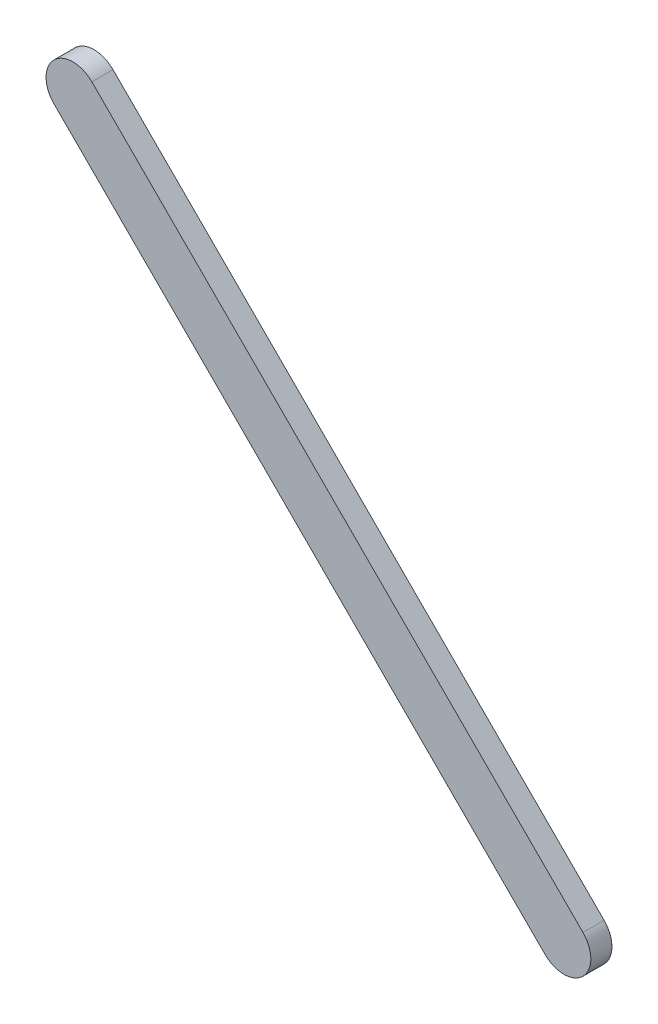
ISO-10303-21;
HEADER;
FILE_DESCRIPTION(('STEP AP214'),'2;1');
FILE_NAME('part.step','',(''),(''),'','','');
FILE_SCHEMA(('AUTOMOTIVE_DESIGN { 1 0 10303 214 1 1 1 1 }'));
ENDSEC;
DATA;
#1=APPLICATION_CONTEXT('core data for automotive mechanical design processes');
#2=APPLICATION_PROTOCOL_DEFINITION('international standard','automotive_design',2000,#1);
#3=PRODUCT_CONTEXT('',#1,'mechanical');
#4=PRODUCT('Part','Part','',(#3));
#5=PRODUCT_RELATED_PRODUCT_CATEGORY('part','',(#4));
#6=PRODUCT_DEFINITION_FORMATION('','',#4);
#7=PRODUCT_DEFINITION_CONTEXT('part definition',#1,'design');
#8=PRODUCT_DEFINITION('design','',#6,#7);
#9=PRODUCT_DEFINITION_SHAPE('','',#8);
#10=(LENGTH_UNIT() NAMED_UNIT(*) SI_UNIT(.MILLI.,.METRE.));
#11=(NAMED_UNIT(*) PLANE_ANGLE_UNIT() SI_UNIT($,.RADIAN.));
#12=(NAMED_UNIT(*) SI_UNIT($,.STERADIAN.) SOLID_ANGLE_UNIT());
#13=UNCERTAINTY_MEASURE_WITH_UNIT(LENGTH_MEASURE(1.E-05),#10,'distance_accuracy_value','');
#14=(GEOMETRIC_REPRESENTATION_CONTEXT(3) GLOBAL_UNCERTAINTY_ASSIGNED_CONTEXT((#13)) GLOBAL_UNIT_ASSIGNED_CONTEXT((#10,
#11,#12)) REPRESENTATION_CONTEXT('',''));
#15=CARTESIAN_POINT('',(0.,0.,0.));
#16=DIRECTION('',(0.,0.,1.));
#17=DIRECTION('',(1.,0.,0.));
#18=AXIS2_PLACEMENT_3D('',#15,#16,#17);
#19=CARTESIAN_POINT('',(105.5351966,68.37499406,0.));
#20=DIRECTION('',(0.707106781186549,0.707106781186546,0.));
#21=DIRECTION('',(0.707106781186546,-0.707106781186549,0.));
#22=AXIS2_PLACEMENT_3D('',#19,#20,#21);
#23=PLANE('',#22);
#24=DIRECTION('',(0.707106781186546,-0.707106781186549,0.));
#25=VECTOR('',#24,1.);
#26=CARTESIAN_POINT('',(105.5351966,68.37499406,0.1999996));
#27=LINE('',#26,#25);
#28=CARTESIAN_POINT('',(105.5351966,68.37499406,0.1999996));
#29=VERTEX_POINT('',#28);
#30=CARTESIAN_POINT('',(110.18339406,63.7267966,0.1999996));
#31=VERTEX_POINT('',#30);
#32=EDGE_CURVE('E11',#29,#31,#27,.T.);
#33=ORIENTED_EDGE('',*,*,#32,.F.);
#34=DIRECTION('',(0.,0.,1.));
#35=VECTOR('',#34,1.);
#36=CARTESIAN_POINT('',(105.5351966,68.37499406,0.));
#37=LINE('',#36,#35);
#38=CARTESIAN_POINT('',(105.5351966,68.37499406,0.));
#39=VERTEX_POINT('',#38);
#40=EDGE_CURVE('E24',#39,#29,#37,.T.);
#41=ORIENTED_EDGE('',*,*,#40,.F.);
#42=DIRECTION('',(0.707106781186546,-0.707106781186549,0.));
#43=VECTOR('',#42,1.);
#44=CARTESIAN_POINT('',(105.5351966,68.37499406,0.));
#45=LINE('',#44,#43);
#46=CARTESIAN_POINT('',(110.18339406,63.7267966,0.));
#47=VERTEX_POINT('',#46);
#48=EDGE_CURVE('E75',#39,#47,#45,.T.);
#49=ORIENTED_EDGE('',*,*,#48,.T.);
#50=DIRECTION('',(0.,0.,1.));
#51=VECTOR('',#50,1.);
#52=CARTESIAN_POINT('',(110.18339406,63.7267966,0.));
#53=LINE('',#52,#51);
#54=EDGE_CURVE('E37',#47,#31,#53,.T.);
#55=ORIENTED_EDGE('',*,*,#54,.T.);
#56=EDGE_LOOP('',(#33,#41,#49,#55));
#57=FACE_BOUND('',#56,.T.);
#58=ADVANCED_FACE('F17',(#57),#23,.F.);
#59=CARTESIAN_POINT('',(110.36299873,63.90640127,0.));
#60=DIRECTION('',(0.,0.,-1.));
#61=DIRECTION('',(-0.707106781186548,-0.707106781186548,0.));
#62=AXIS2_PLACEMENT_3D('',#59,#60,#61);
#63=CYLINDRICAL_SURFACE('',#62,0.253999360179556);
#64=CARTESIAN_POINT('',(110.36299873,63.90640127,0.1999996));
#65=DIRECTION('',(0.,0.,1.));
#66=DIRECTION('',(-0.707106781186548,-0.707106781186548,0.));
#67=AXIS2_PLACEMENT_3D('',#64,#65,#66);
#68=CIRCLE('',#67,0.253999360179556);
#69=CARTESIAN_POINT('',(110.5426034,64.08600594,0.1999996));
#70=VERTEX_POINT('',#69);
#71=EDGE_CURVE('E83',#31,#70,#68,.T.);
#72=ORIENTED_EDGE('',*,*,#71,.F.);
#73=ORIENTED_EDGE('',*,*,#54,.F.);
#74=CARTESIAN_POINT('',(110.36299873,63.90640127,0.));
#75=DIRECTION('',(0.,0.,1.));
#76=DIRECTION('',(-0.707106781186548,-0.707106781186548,0.));
#77=AXIS2_PLACEMENT_3D('',#74,#75,#76);
#78=CIRCLE('',#77,0.253999360179556);
#79=CARTESIAN_POINT('',(110.5426034,64.08600594,0.));
#80=VERTEX_POINT('',#79);
#81=EDGE_CURVE('E81',#47,#80,#78,.T.);
#82=ORIENTED_EDGE('',*,*,#81,.T.);
#83=DIRECTION('',(0.,0.,1.));
#84=VECTOR('',#83,1.);
#85=CARTESIAN_POINT('',(110.5426034,64.08600594,0.));
#86=LINE('',#85,#84);
#87=EDGE_CURVE('E67',#80,#70,#86,.T.);
#88=ORIENTED_EDGE('',*,*,#87,.T.);
#89=EDGE_LOOP('',(#72,#73,#82,#88));
#90=FACE_BOUND('',#89,.T.);
#91=ADVANCED_FACE('F89',(#90),#63,.T.);
#92=CARTESIAN_POINT('',(110.5426034,64.08600594,0.));
#93=DIRECTION('',(-0.707106781186545,-0.70710678118655,0.));
#94=DIRECTION('',(-0.70710678118655,0.707106781186545,0.));
#95=AXIS2_PLACEMENT_3D('',#92,#93,#94);
#96=PLANE('',#95);
#97=DIRECTION('',(-0.70710678118655,0.707106781186545,0.));
#98=VECTOR('',#97,1.);
#99=CARTESIAN_POINT('',(110.5426034,64.08600594,0.1999996));
#100=LINE('',#99,#98);
#101=CARTESIAN_POINT('',(105.89440594,68.7342034,0.1999996));
#102=VERTEX_POINT('',#101);
#103=EDGE_CURVE('E71',#70,#102,#100,.T.);
#104=ORIENTED_EDGE('',*,*,#103,.F.);
#105=ORIENTED_EDGE('',*,*,#87,.F.);
#106=DIRECTION('',(-0.70710678118655,0.707106781186545,0.));
#107=VECTOR('',#106,1.);
#108=CARTESIAN_POINT('',(110.5426034,64.08600594,0.));
#109=LINE('',#108,#107);
#110=CARTESIAN_POINT('',(105.89440594,68.7342034,0.));
#111=VERTEX_POINT('',#110);
#112=EDGE_CURVE('E63',#80,#111,#109,.T.);
#113=ORIENTED_EDGE('',*,*,#112,.T.);
#114=DIRECTION('',(0.,0.,1.));
#115=VECTOR('',#114,1.);
#116=CARTESIAN_POINT('',(105.89440594,68.7342034,0.));
#117=LINE('',#116,#115);
#118=EDGE_CURVE('E53',#111,#102,#117,.T.);
#119=ORIENTED_EDGE('',*,*,#118,.T.);
#120=EDGE_LOOP('',(#104,#105,#113,#119));
#121=FACE_BOUND('',#120,.T.);
#122=ADVANCED_FACE('F66',(#121),#96,.F.);
#123=CARTESIAN_POINT('',(105.71480127,68.55459873,0.));
#124=DIRECTION('',(0.,0.,-1.));
#125=DIRECTION('',(0.70710678118652,0.707106781186576,0.));
#126=AXIS2_PLACEMENT_3D('',#123,#124,#125);
#127=CYLINDRICAL_SURFACE('',#126,0.253999360179539);
#128=CARTESIAN_POINT('',(105.71480127,68.55459873,0.1999996));
#129=DIRECTION('',(0.,0.,1.));
#130=DIRECTION('',(0.70710678118652,0.707106781186576,0.));
#131=AXIS2_PLACEMENT_3D('',#128,#129,#130);
#132=CIRCLE('',#131,0.253999360179539);
#133=EDGE_CURVE('E59',#102,#29,#132,.T.);
#134=ORIENTED_EDGE('',*,*,#133,.F.);
#135=ORIENTED_EDGE('',*,*,#118,.F.);
#136=CARTESIAN_POINT('',(105.71480127,68.55459873,0.));
#137=DIRECTION('',(0.,0.,1.));
#138=DIRECTION('',(0.70710678118652,0.707106781186576,0.));
#139=AXIS2_PLACEMENT_3D('',#136,#137,#138);
#140=CIRCLE('',#139,0.253999360179539);
#141=EDGE_CURVE('E57',#111,#39,#140,.T.);
#142=ORIENTED_EDGE('',*,*,#141,.T.);
#143=ORIENTED_EDGE('',*,*,#40,.T.);
#144=EDGE_LOOP('',(#134,#135,#142,#143));
#145=FACE_BOUND('',#144,.T.);
#146=ADVANCED_FACE('F55',(#145),#127,.T.);
#147=CARTESIAN_POINT('',(105.5351966,68.37499406,0.));
#148=DIRECTION('',(0.,0.,-1.));
#149=DIRECTION('',(-1.,0.,0.));
#150=AXIS2_PLACEMENT_3D('',#147,#148,#149);
#151=PLANE('',#150);
#152=ORIENTED_EDGE('',*,*,#141,.F.);
#153=ORIENTED_EDGE('',*,*,#112,.F.);
#154=ORIENTED_EDGE('',*,*,#81,.F.);
#155=ORIENTED_EDGE('',*,*,#48,.F.);
#156=EDGE_LOOP('',(#152,#153,#154,#155));
#157=FACE_BOUND('',#156,.T.);
#158=ADVANCED_FACE('F74',(#157),#151,.T.);
#159=CARTESIAN_POINT('',(105.5351966,68.37499406,0.1999996));
#160=DIRECTION('',(0.,0.,-1.));
#161=DIRECTION('',(-1.,0.,0.));
#162=AXIS2_PLACEMENT_3D('',#159,#160,#161);
#163=PLANE('',#162);
#164=ORIENTED_EDGE('',*,*,#32,.T.);
#165=ORIENTED_EDGE('',*,*,#71,.T.);
#166=ORIENTED_EDGE('',*,*,#103,.T.);
#167=ORIENTED_EDGE('',*,*,#133,.T.);
#168=EDGE_LOOP('',(#164,#165,#166,#167));
#169=FACE_BOUND('',#168,.T.);
#170=ADVANCED_FACE('F91',(#169),#163,.F.);
#171=CLOSED_SHELL('',(#58,#91,#122,#146,#158,#170));
#172=MANIFOLD_SOLID_BREP('B1',#171);
#173=ADVANCED_BREP_SHAPE_REPRESENTATION('',(#18,#172),#14);
#174=SHAPE_DEFINITION_REPRESENTATION(#9,#173);
ENDSEC;
END-ISO-10303-21;
